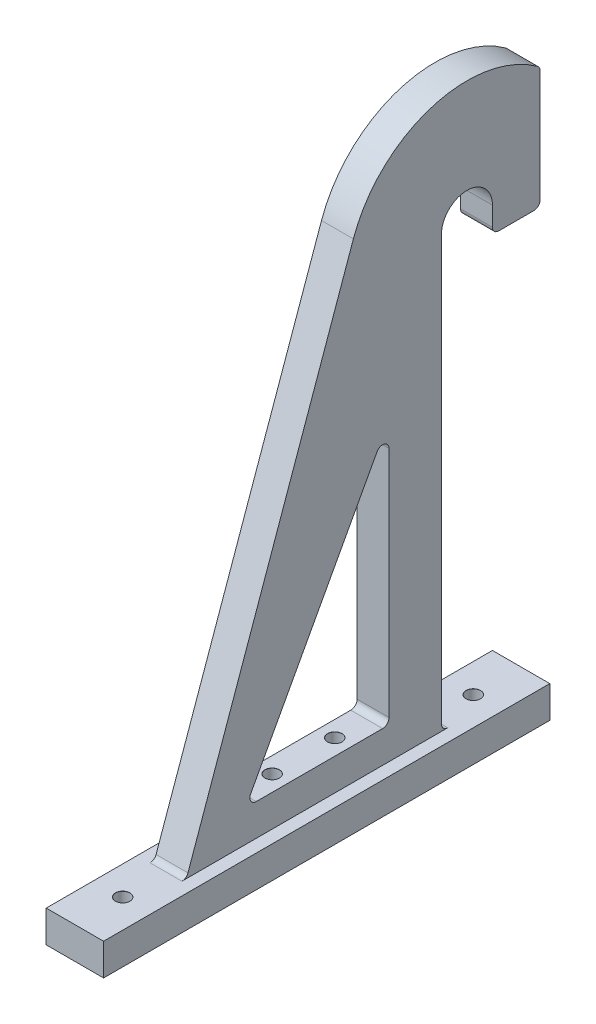
ISO-10303-21;
HEADER;
FILE_DESCRIPTION(('STEP AP214'),'2;1');
FILE_NAME('part.step','',(''),(''),'','','');
FILE_SCHEMA(('AUTOMOTIVE_DESIGN { 1 0 10303 214 1 1 1 1 }'));
ENDSEC;
DATA;
#1=APPLICATION_CONTEXT('core data for automotive mechanical design processes');
#2=APPLICATION_PROTOCOL_DEFINITION('international standard','automotive_design',2000,#1);
#3=PRODUCT_CONTEXT('',#1,'mechanical');
#4=PRODUCT('Part','Part','',(#3));
#5=PRODUCT_RELATED_PRODUCT_CATEGORY('part','',(#4));
#6=PRODUCT_DEFINITION_FORMATION('','',#4);
#7=PRODUCT_DEFINITION_CONTEXT('part definition',#1,'design');
#8=PRODUCT_DEFINITION('design','',#6,#7);
#9=PRODUCT_DEFINITION_SHAPE('','',#8);
#10=(LENGTH_UNIT() NAMED_UNIT(*) SI_UNIT(.MILLI.,.METRE.));
#11=(NAMED_UNIT(*) PLANE_ANGLE_UNIT() SI_UNIT($,.RADIAN.));
#12=(NAMED_UNIT(*) SI_UNIT($,.STERADIAN.) SOLID_ANGLE_UNIT());
#13=UNCERTAINTY_MEASURE_WITH_UNIT(LENGTH_MEASURE(1.E-05),#10,'distance_accuracy_value','');
#14=(GEOMETRIC_REPRESENTATION_CONTEXT(3) GLOBAL_UNCERTAINTY_ASSIGNED_CONTEXT((#13)) GLOBAL_UNIT_ASSIGNED_CONTEXT((#10,
#11,#12)) REPRESENTATION_CONTEXT('',''));
#15=CARTESIAN_POINT('',(0.,0.,0.));
#16=DIRECTION('',(0.,0.,1.));
#17=DIRECTION('',(1.,0.,0.));
#18=AXIS2_PLACEMENT_3D('',#15,#16,#17);
#19=CARTESIAN_POINT('',(-9.01,0.,-107.32073380901));
#20=DIRECTION('',(0.,1.,0.));
#21=DIRECTION('',(0.,0.,1.));
#22=AXIS2_PLACEMENT_3D('',#19,#20,#21);
#23=PLANE('',#22);
#24=CARTESIAN_POINT('',(0.,0.,8.0932319262162));
#25=DIRECTION('',(0.,1.,0.));
#26=DIRECTION('',(0.,0.,1.));
#27=AXIS2_PLACEMENT_3D('',#24,#25,#26);
#28=CIRCLE('',#27,2.25);
#29=CARTESIAN_POINT('',(0.,0.,10.3432319262162));
#30=VERTEX_POINT('',#29);
#31=EDGE_CURVE('E142',#30,#30,#28,.T.);
#32=ORIENTED_EDGE('',*,*,#31,.F.);
#33=EDGE_LOOP('',(#32));
#34=FACE_BOUND('',#33,.T.);
#35=CARTESIAN_POINT('',(0.,0.,-11.5473950131723));
#36=DIRECTION('',(0.,1.,0.));
#37=DIRECTION('',(0.,0.,1.));
#38=AXIS2_PLACEMENT_3D('',#35,#36,#37);
#39=CIRCLE('',#38,2.25);
#40=CARTESIAN_POINT('',(0.,0.,-9.2973950131723));
#41=VERTEX_POINT('',#40);
#42=EDGE_CURVE('E145',#41,#41,#39,.T.);
#43=ORIENTED_EDGE('',*,*,#42,.F.);
#44=EDGE_LOOP('',(#43));
#45=FACE_BOUND('',#44,.T.);
#46=CARTESIAN_POINT('',(0.,0.,55.));
#47=DIRECTION('',(0.,1.,0.));
#48=DIRECTION('',(0.,0.,1.));
#49=AXIS2_PLACEMENT_3D('',#46,#47,#48);
#50=CIRCLE('',#49,2.275);
#51=CARTESIAN_POINT('',(0.,0.,57.275));
#52=VERTEX_POINT('',#51);
#53=EDGE_CURVE('E148',#52,#52,#50,.T.);
#54=ORIENTED_EDGE('',*,*,#53,.F.);
#55=EDGE_LOOP('',(#54));
#56=FACE_BOUND('',#55,.T.);
#57=CARTESIAN_POINT('',(0.,0.,-55.));
#58=DIRECTION('',(0.,1.,0.));
#59=DIRECTION('',(0.,0.,1.));
#60=AXIS2_PLACEMENT_3D('',#57,#58,#59);
#61=CIRCLE('',#60,2.275);
#62=CARTESIAN_POINT('',(0.,0.,-52.725));
#63=VERTEX_POINT('',#62);
#64=EDGE_CURVE('E157',#63,#63,#61,.T.);
#65=ORIENTED_EDGE('',*,*,#64,.F.);
#66=EDGE_LOOP('',(#65));
#67=FACE_BOUND('',#66,.T.);
#68=DIRECTION('',(1.,0.,0.));
#69=VECTOR('',#68,1.);
#70=CARTESIAN_POINT('',(0.,0.,70.));
#71=LINE('',#70,#69);
#72=CARTESIAN_POINT('',(-9.,0.,70.));
#73=VERTEX_POINT('',#72);
#74=CARTESIAN_POINT('',(9.,0.,70.));
#75=VERTEX_POINT('',#74);
#76=EDGE_CURVE('E176',#73,#75,#71,.T.);
#77=ORIENTED_EDGE('',*,*,#76,.T.);
#78=DIRECTION('',(0.,0.,1.));
#79=VECTOR('',#78,1.);
#80=CARTESIAN_POINT('',(9.,0.,-70.));
#81=LINE('',#80,#79);
#82=CARTESIAN_POINT('',(9.,0.,-70.));
#83=VERTEX_POINT('',#82);
#84=EDGE_CURVE('E173',#83,#75,#81,.T.);
#85=ORIENTED_EDGE('',*,*,#84,.F.);
#86=DIRECTION('',(1.,0.,0.));
#87=VECTOR('',#86,1.);
#88=CARTESIAN_POINT('',(0.,0.,-70.));
#89=LINE('',#88,#87);
#90=CARTESIAN_POINT('',(-9.,0.,-70.));
#91=VERTEX_POINT('',#90);
#92=EDGE_CURVE('E172',#91,#83,#89,.T.);
#93=ORIENTED_EDGE('',*,*,#92,.F.);
#94=DIRECTION('',(0.,0.,-1.));
#95=VECTOR('',#94,1.);
#96=CARTESIAN_POINT('',(-9.,0.,-70.));
#97=LINE('',#96,#95);
#98=EDGE_CURVE('E187',#73,#91,#97,.T.);
#99=ORIENTED_EDGE('',*,*,#98,.F.);
#100=EDGE_LOOP('',(#77,#85,#93,#99));
#101=FACE_BOUND('',#100,.T.);
#102=ADVANCED_FACE('F65',(#34,#45,#56,#67,#101),#23,.T.);
#103=CARTESIAN_POINT('',(9.,-5.,0.));
#104=DIRECTION('',(1.,0.,0.));
#105=DIRECTION('',(0.,1.,0.));
#106=AXIS2_PLACEMENT_3D('',#103,#104,#105);
#107=PLANE('',#106);
#108=DIRECTION('',(0.,0.,-1.));
#109=VECTOR('',#108,1.);
#110=CARTESIAN_POINT('',(9.,-10.,70.));
#111=LINE('',#110,#109);
#112=CARTESIAN_POINT('',(9.,-10.,70.));
#113=VERTEX_POINT('',#112);
#114=CARTESIAN_POINT('',(9.,-10.,-70.));
#115=VERTEX_POINT('',#114);
#116=EDGE_CURVE('E166',#113,#115,#111,.T.);
#117=ORIENTED_EDGE('',*,*,#116,.T.);
#118=DIRECTION('',(0.,1.,0.));
#119=VECTOR('',#118,1.);
#120=CARTESIAN_POINT('',(9.,-10.,-70.));
#121=LINE('',#120,#119);
#122=EDGE_CURVE('E169',#115,#83,#121,.T.);
#123=ORIENTED_EDGE('',*,*,#122,.T.);
#124=ORIENTED_EDGE('',*,*,#84,.T.);
#125=DIRECTION('',(0.,-1.,0.));
#126=VECTOR('',#125,1.);
#127=CARTESIAN_POINT('',(9.,0.,70.));
#128=LINE('',#127,#126);
#129=EDGE_CURVE('E180',#75,#113,#128,.T.);
#130=ORIENTED_EDGE('',*,*,#129,.T.);
#131=EDGE_LOOP('',(#117,#123,#124,#130));
#132=FACE_BOUND('',#131,.T.);
#133=ADVANCED_FACE('F219',(#132),#107,.T.);
#134=CARTESIAN_POINT('',(0.,-10.,70.));
#135=DIRECTION('',(0.,-1.,0.));
#136=DIRECTION('',(0.,0.,-1.));
#137=AXIS2_PLACEMENT_3D('',#134,#135,#136);
#138=PLANE('',#137);
#139=CARTESIAN_POINT('',(0.,-10.,55.));
#140=DIRECTION('',(0.,1.,0.));
#141=DIRECTION('',(0.,0.,1.));
#142=AXIS2_PLACEMENT_3D('',#139,#140,#141);
#143=CIRCLE('',#142,2.25);
#144=CARTESIAN_POINT('',(0.,-10.,57.25));
#145=VERTEX_POINT('',#144);
#146=EDGE_CURVE('E154',#145,#145,#143,.T.);
#147=ORIENTED_EDGE('',*,*,#146,.T.);
#148=EDGE_LOOP('',(#147));
#149=FACE_BOUND('',#148,.T.);
#150=CARTESIAN_POINT('',(0.,-10.,-55.));
#151=DIRECTION('',(0.,1.,0.));
#152=DIRECTION('',(0.,0.,1.));
#153=AXIS2_PLACEMENT_3D('',#150,#151,#152);
#154=CIRCLE('',#153,2.25);
#155=CARTESIAN_POINT('',(0.,-10.,-52.75));
#156=VERTEX_POINT('',#155);
#157=EDGE_CURVE('E163',#156,#156,#154,.T.);
#158=ORIENTED_EDGE('',*,*,#157,.T.);
#159=EDGE_LOOP('',(#158));
#160=FACE_BOUND('',#159,.T.);
#161=DIRECTION('',(1.,0.,0.));
#162=VECTOR('',#161,1.);
#163=CARTESIAN_POINT('',(0.,-10.,-70.));
#164=LINE('',#163,#162);
#165=CARTESIAN_POINT('',(-9.,-10.,-70.));
#166=VERTEX_POINT('',#165);
#167=EDGE_CURVE('E86',#166,#115,#164,.T.);
#168=ORIENTED_EDGE('',*,*,#167,.T.);
#169=ORIENTED_EDGE('',*,*,#116,.F.);
#170=DIRECTION('',(-1.,0.,0.));
#171=VECTOR('',#170,1.);
#172=CARTESIAN_POINT('',(0.,-10.,70.));
#173=LINE('',#172,#171);
#174=CARTESIAN_POINT('',(-9.,-10.,70.));
#175=VERTEX_POINT('',#174);
#176=EDGE_CURVE('E96',#113,#175,#173,.T.);
#177=ORIENTED_EDGE('',*,*,#176,.T.);
#178=DIRECTION('',(0.,0.,1.));
#179=VECTOR('',#178,1.);
#180=CARTESIAN_POINT('',(-9.,-10.,70.));
#181=LINE('',#180,#179);
#182=EDGE_CURVE('E12',#166,#175,#181,.T.);
#183=ORIENTED_EDGE('',*,*,#182,.F.);
#184=EDGE_LOOP('',(#168,#169,#177,#183));
#185=FACE_BOUND('',#184,.T.);
#186=ADVANCED_FACE('F221',(#149,#160,#185),#138,.T.);
#187=CARTESIAN_POINT('',(0.,-10.,-70.));
#188=DIRECTION('',(0.,0.,-1.));
#189=DIRECTION('',(0.,-1.,0.));
#190=AXIS2_PLACEMENT_3D('',#187,#188,#189);
#191=PLANE('',#190);
#192=ORIENTED_EDGE('',*,*,#92,.T.);
#193=ORIENTED_EDGE('',*,*,#122,.F.);
#194=ORIENTED_EDGE('',*,*,#167,.F.);
#195=DIRECTION('',(0.,-1.,0.));
#196=VECTOR('',#195,1.);
#197=CARTESIAN_POINT('',(-9.,-10.,-70.));
#198=LINE('',#197,#196);
#199=EDGE_CURVE('E186',#91,#166,#198,.T.);
#200=ORIENTED_EDGE('',*,*,#199,.F.);
#201=EDGE_LOOP('',(#192,#193,#194,#200));
#202=FACE_BOUND('',#201,.T.);
#203=ADVANCED_FACE('F227',(#202),#191,.T.);
#204=CARTESIAN_POINT('',(0.,0.,70.));
#205=DIRECTION('',(0.,0.,1.));
#206=DIRECTION('',(1.,0.,0.));
#207=AXIS2_PLACEMENT_3D('',#204,#205,#206);
#208=PLANE('',#207);
#209=ORIENTED_EDGE('',*,*,#176,.F.);
#210=ORIENTED_EDGE('',*,*,#129,.F.);
#211=ORIENTED_EDGE('',*,*,#76,.F.);
#212=DIRECTION('',(0.,1.,0.));
#213=VECTOR('',#212,1.);
#214=CARTESIAN_POINT('',(-9.,0.,70.));
#215=LINE('',#214,#213);
#216=EDGE_CURVE('E74',#175,#73,#215,.T.);
#217=ORIENTED_EDGE('',*,*,#216,.F.);
#218=EDGE_LOOP('',(#209,#210,#211,#217));
#219=FACE_BOUND('',#218,.T.);
#220=ADVANCED_FACE('F237',(#219),#208,.T.);
#221=CARTESIAN_POINT('',(-9.,-5.,0.));
#222=DIRECTION('',(-1.,0.,0.));
#223=DIRECTION('',(0.,0.,1.));
#224=AXIS2_PLACEMENT_3D('',#221,#222,#223);
#225=PLANE('',#224);
#226=ORIENTED_EDGE('',*,*,#182,.T.);
#227=ORIENTED_EDGE('',*,*,#216,.T.);
#228=ORIENTED_EDGE('',*,*,#98,.T.);
#229=ORIENTED_EDGE('',*,*,#199,.T.);
#230=EDGE_LOOP('',(#226,#227,#228,#229));
#231=FACE_BOUND('',#230,.T.);
#232=ADVANCED_FACE('F233',(#231),#225,.T.);
#233=CARTESIAN_POINT('',(0.,0.,-55.));
#234=DIRECTION('',(0.,1.,0.));
#235=DIRECTION('',(0.,0.,1.));
#236=AXIS2_PLACEMENT_3D('',#233,#234,#235);
#237=CYLINDRICAL_SURFACE('',#236,2.25);
#238=ORIENTED_EDGE('',*,*,#157,.F.);
#239=EDGE_LOOP('',(#238));
#240=FACE_BOUND('',#239,.T.);
#241=CARTESIAN_POINT('',(0.,-0.0250000000000025,-55.));
#242=DIRECTION('',(0.,1.,0.));
#243=DIRECTION('',(0.,0.,1.));
#244=AXIS2_PLACEMENT_3D('',#241,#242,#243);
#245=CIRCLE('',#244,2.25);
#246=CARTESIAN_POINT('',(0.,-0.0250000000000025,-52.75));
#247=VERTEX_POINT('',#246);
#248=EDGE_CURVE('E160',#247,#247,#245,.T.);
#249=ORIENTED_EDGE('',*,*,#248,.T.);
#250=EDGE_LOOP('',(#249));
#251=FACE_BOUND('',#250,.T.);
#252=ADVANCED_FACE('F232',(#240,#251),#237,.F.);
#253=CARTESIAN_POINT('',(0.,0.,-55.));
#254=DIRECTION('',(0.,1.,0.));
#255=DIRECTION('',(0.,0.,1.));
#256=AXIS2_PLACEMENT_3D('',#253,#254,#255);
#257=CONICAL_SURFACE('',#256,2.275,0.785398163397414);
#258=ORIENTED_EDGE('',*,*,#248,.F.);
#259=EDGE_LOOP('',(#258));
#260=FACE_BOUND('',#259,.T.);
#261=ORIENTED_EDGE('',*,*,#64,.T.);
#262=EDGE_LOOP('',(#261));
#263=FACE_BOUND('',#262,.T.);
#264=ADVANCED_FACE('F245',(#260,#263),#257,.F.);
#265=CARTESIAN_POINT('',(0.,0.,55.));
#266=DIRECTION('',(0.,1.,0.));
#267=DIRECTION('',(0.,0.,1.));
#268=AXIS2_PLACEMENT_3D('',#265,#266,#267);
#269=CYLINDRICAL_SURFACE('',#268,2.25);
#270=ORIENTED_EDGE('',*,*,#146,.F.);
#271=EDGE_LOOP('',(#270));
#272=FACE_BOUND('',#271,.T.);
#273=CARTESIAN_POINT('',(0.,-0.0250000000000025,55.));
#274=DIRECTION('',(0.,1.,0.));
#275=DIRECTION('',(0.,0.,1.));
#276=AXIS2_PLACEMENT_3D('',#273,#274,#275);
#277=CIRCLE('',#276,2.25);
#278=CARTESIAN_POINT('',(0.,-0.0250000000000025,57.25));
#279=VERTEX_POINT('',#278);
#280=EDGE_CURVE('E151',#279,#279,#277,.T.);
#281=ORIENTED_EDGE('',*,*,#280,.T.);
#282=EDGE_LOOP('',(#281));
#283=FACE_BOUND('',#282,.T.);
#284=ADVANCED_FACE('F249',(#272,#283),#269,.F.);
#285=CARTESIAN_POINT('',(0.,0.,55.));
#286=DIRECTION('',(0.,1.,0.));
#287=DIRECTION('',(0.,0.,1.));
#288=AXIS2_PLACEMENT_3D('',#285,#286,#287);
#289=CONICAL_SURFACE('',#288,2.275,0.785398163397414);
#290=ORIENTED_EDGE('',*,*,#280,.F.);
#291=EDGE_LOOP('',(#290));
#292=FACE_BOUND('',#291,.T.);
#293=ORIENTED_EDGE('',*,*,#53,.T.);
#294=EDGE_LOOP('',(#293));
#295=FACE_BOUND('',#294,.T.);
#296=ADVANCED_FACE('F253',(#292,#295),#289,.F.);
#297=CARTESIAN_POINT('',(0.,0.,-11.5473950131723));
#298=DIRECTION('',(0.,1.,0.));
#299=DIRECTION('',(0.,0.,1.));
#300=AXIS2_PLACEMENT_3D('',#297,#298,#299);
#301=CONICAL_SURFACE('',#300,2.25,1.02974425867665);
#302=CARTESIAN_POINT('',(0.,-0.330473340465158,-11.5473950131723));
#303=DIRECTION('',(0.,1.,0.));
#304=DIRECTION('',(0.,0.,1.));
#305=AXIS2_PLACEMENT_3D('',#302,#303,#304);
#306=CIRCLE('',#305,1.7);
#307=CARTESIAN_POINT('',(0.,-0.330473340465159,-9.8473950131723));
#308=VERTEX_POINT('',#307);
#309=EDGE_CURVE('E68',#308,#308,#306,.F.);
#310=ORIENTED_EDGE('',*,*,#309,.T.);
#311=EDGE_LOOP('',(#310));
#312=FACE_BOUND('',#311,.T.);
#313=ORIENTED_EDGE('',*,*,#42,.T.);
#314=EDGE_LOOP('',(#313));
#315=FACE_BOUND('',#314,.T.);
#316=ADVANCED_FACE('F216',(#312,#315),#301,.F.);
#317=CARTESIAN_POINT('',(0.,0.,8.0932319262162));
#318=DIRECTION('',(0.,1.,0.));
#319=DIRECTION('',(0.,0.,1.));
#320=AXIS2_PLACEMENT_3D('',#317,#318,#319);
#321=CONICAL_SURFACE('',#320,2.25,1.02974425867665);
#322=CARTESIAN_POINT('',(0.,-0.33047334046516,8.0932319262162));
#323=DIRECTION('',(0.,1.,0.));
#324=DIRECTION('',(0.,0.,1.));
#325=AXIS2_PLACEMENT_3D('',#322,#323,#324);
#326=CIRCLE('',#325,1.7);
#327=CARTESIAN_POINT('',(0.,-0.33047334046516,9.7932319262162));
#328=VERTEX_POINT('',#327);
#329=EDGE_CURVE('E141',#328,#328,#326,.F.);
#330=ORIENTED_EDGE('',*,*,#329,.T.);
#331=EDGE_LOOP('',(#330));
#332=FACE_BOUND('',#331,.T.);
#333=ORIENTED_EDGE('',*,*,#31,.T.);
#334=EDGE_LOOP('',(#333));
#335=FACE_BOUND('',#334,.T.);
#336=ADVANCED_FACE('F202',(#332,#335),#321,.F.);
#337=CARTESIAN_POINT('',(0.,0.,8.0932319262162));
#338=DIRECTION('',(0.,1.,0.));
#339=DIRECTION('',(0.,0.,1.));
#340=AXIS2_PLACEMENT_3D('',#337,#338,#339);
#341=CYLINDRICAL_SURFACE('',#340,1.7);
#342=CARTESIAN_POINT('',(0.,-5.,8.0932319262162));
#343=DIRECTION('',(0.,1.,0.));
#344=DIRECTION('',(0.,0.,1.));
#345=AXIS2_PLACEMENT_3D('',#342,#343,#344);
#346=CIRCLE('',#345,1.7);
#347=CARTESIAN_POINT('',(0.,-5.,9.7932319262162));
#348=VERTEX_POINT('',#347);
#349=EDGE_CURVE('E137',#348,#348,#346,.T.);
#350=ORIENTED_EDGE('',*,*,#349,.F.);
#351=EDGE_LOOP('',(#350));
#352=FACE_BOUND('',#351,.T.);
#353=ORIENTED_EDGE('',*,*,#329,.F.);
#354=EDGE_LOOP('',(#353));
#355=FACE_BOUND('',#354,.T.);
#356=ADVANCED_FACE('F205',(#352,#355),#341,.F.);
#357=CARTESIAN_POINT('',(0.,-5.,8.0932319262162));
#358=DIRECTION('',(0.,1.,0.));
#359=DIRECTION('',(0.,0.,1.));
#360=AXIS2_PLACEMENT_3D('',#357,#358,#359);
#361=CONICAL_SURFACE('',#360,1.7,1.02974425867665);
#362=CARTESIAN_POINT('',(0.,-6.02146305234685,8.0932319262162));
#363=VERTEX_POINT('',#362);
#364=VERTEX_LOOP('',#363);
#365=FACE_BOUND('',#364,.T.);
#366=ORIENTED_EDGE('',*,*,#349,.T.);
#367=EDGE_LOOP('',(#366));
#368=FACE_BOUND('',#367,.T.);
#369=ADVANCED_FACE('F207',(#365,#368),#361,.F.);
#370=CARTESIAN_POINT('',(0.,0.,-11.5473950131723));
#371=DIRECTION('',(0.,1.,0.));
#372=DIRECTION('',(0.,0.,1.));
#373=AXIS2_PLACEMENT_3D('',#370,#371,#372);
#374=CYLINDRICAL_SURFACE('',#373,1.7);
#375=CARTESIAN_POINT('',(0.,-5.,-11.5473950131723));
#376=DIRECTION('',(0.,1.,0.));
#377=DIRECTION('',(0.,0.,1.));
#378=AXIS2_PLACEMENT_3D('',#375,#376,#377);
#379=CIRCLE('',#378,1.7);
#380=CARTESIAN_POINT('',(0.,-5.,-9.8473950131723));
#381=VERTEX_POINT('',#380);
#382=EDGE_CURVE('E133',#381,#381,#379,.T.);
#383=ORIENTED_EDGE('',*,*,#382,.F.);
#384=EDGE_LOOP('',(#383));
#385=FACE_BOUND('',#384,.T.);
#386=ORIENTED_EDGE('',*,*,#309,.F.);
#387=EDGE_LOOP('',(#386));
#388=FACE_BOUND('',#387,.T.);
#389=ADVANCED_FACE('F129',(#385,#388),#374,.F.);
#390=CARTESIAN_POINT('',(0.,-5.,-11.5473950131723));
#391=DIRECTION('',(0.,1.,0.));
#392=DIRECTION('',(0.,0.,1.));
#393=AXIS2_PLACEMENT_3D('',#390,#391,#392);
#394=CONICAL_SURFACE('',#393,1.7,1.02974425867665);
#395=CARTESIAN_POINT('',(0.,-6.02146305234685,-11.5473950131723));
#396=VERTEX_POINT('',#395);
#397=VERTEX_LOOP('',#396);
#398=FACE_BOUND('',#397,.T.);
#399=ORIENTED_EDGE('',*,*,#382,.T.);
#400=EDGE_LOOP('',(#399));
#401=FACE_BOUND('',#400,.T.);
#402=ADVANCED_FACE('F126',(#398,#401),#394,.F.);
#403=CLOSED_SHELL('',(#102,#133,#186,#203,#220,#232,#252,#264,#284,#296,#316,#336,#356,#369,
#389,#402));
#404=MANIFOLD_SOLID_BREP('B2',#403);
#405=CARTESIAN_POINT('',(-9.01,0.,-107.32073380901));
#406=DIRECTION('',(0.,1.,0.));
#407=DIRECTION('',(0.,0.,1.));
#408=AXIS2_PLACEMENT_3D('',#405,#406,#407);
#409=PLANE('',#408);
#410=CARTESIAN_POINT('',(0.,0.,8.0932319262162));
#411=DIRECTION('',(0.,1.,0.));
#412=DIRECTION('',(0.,0.,1.));
#413=AXIS2_PLACEMENT_3D('',#410,#411,#412);
#414=CIRCLE('',#413,2.25);
#415=CARTESIAN_POINT('',(0.,0.,10.3432319262162));
#416=VERTEX_POINT('',#415);
#417=EDGE_CURVE('E1074',#416,#416,#414,.T.);
#418=ORIENTED_EDGE('',*,*,#417,.T.);
#419=EDGE_LOOP('',(#418));
#420=FACE_BOUND('',#419,.T.);
#421=CARTESIAN_POINT('',(0.,0.,-11.5473950131723));
#422=DIRECTION('',(0.,1.,0.));
#423=DIRECTION('',(0.,0.,1.));
#424=AXIS2_PLACEMENT_3D('',#421,#422,#423);
#425=CIRCLE('',#424,2.25);
#426=CARTESIAN_POINT('',(0.,0.,-9.2973950131723));
#427=VERTEX_POINT('',#426);
#428=EDGE_CURVE('E821',#427,#427,#425,.T.);
#429=ORIENTED_EDGE('',*,*,#428,.T.);
#430=EDGE_LOOP('',(#429));
#431=FACE_BOUND('',#430,.T.);
#432=DIRECTION('',(0.,0.,1.));
#433=VECTOR('',#432,1.);
#434=CARTESIAN_POINT('',(5.,0.,-42.75));
#435=LINE('',#434,#433);
#436=CARTESIAN_POINT('',(5.,0.,-42.));
#437=VERTEX_POINT('',#436);
#438=CARTESIAN_POINT('',(5.,0.,41.4126332599896));
#439=VERTEX_POINT('',#438);
#440=EDGE_CURVE('E428',#437,#439,#435,.T.);
#441=ORIENTED_EDGE('',*,*,#440,.T.);
#442=DIRECTION('',(1.,0.,0.));
#443=VECTOR('',#442,1.);
#444=CARTESIAN_POINT('',(0.,0.,41.4126332599896));
#445=LINE('',#444,#443);
#446=CARTESIAN_POINT('',(-5.,0.,41.4126332599896));
#447=VERTEX_POINT('',#446);
#448=EDGE_CURVE('E613',#447,#439,#445,.T.);
#449=ORIENTED_EDGE('',*,*,#448,.F.);
#450=DIRECTION('',(0.,0.,-1.));
#451=VECTOR('',#450,1.);
#452=CARTESIAN_POINT('',(-5.,0.,-42.75));
#453=LINE('',#452,#451);
#454=CARTESIAN_POINT('',(-5.,0.,-42.));
#455=VERTEX_POINT('',#454);
#456=EDGE_CURVE('E63',#447,#455,#453,.T.);
#457=ORIENTED_EDGE('',*,*,#456,.T.);
#458=DIRECTION('',(-1.,0.,0.));
#459=VECTOR('',#458,1.);
#460=CARTESIAN_POINT('',(0.,0.,-42.));
#461=LINE('',#460,#459);
#462=EDGE_CURVE('E444',#437,#455,#461,.T.);
#463=ORIENTED_EDGE('',*,*,#462,.F.);
#464=EDGE_LOOP('',(#441,#449,#457,#463));
#465=FACE_BOUND('',#464,.T.);
#466=ADVANCED_FACE('F425',(#420,#431,#465),#409,.F.);
#467=CARTESIAN_POINT('',(5.,86.4010581714358,-15.5));
#468=DIRECTION('',(1.,0.,0.));
#469=DIRECTION('',(0.,1.,0.));
#470=AXIS2_PLACEMENT_3D('',#467,#468,#469);
#471=PLANE('',#470);
#472=DIRECTION('',(0.,0.879107079568804,-0.476624320248147));
#473=VECTOR('',#472,1.);
#474=CARTESIAN_POINT('',(5.,47.2641277411276,1.24916223561393));
#475=LINE('',#474,#473);
#476=CARTESIAN_POINT('',(5.,12.9532486404963,19.8514460853538));
#477=VERTEX_POINT('',#476);
#478=CARTESIAN_POINT('',(5.,86.0681827731462,-19.7891808540347));
#479=VERTEX_POINT('',#478);
#480=EDGE_CURVE('E675',#477,#479,#475,.T.);
#481=ORIENTED_EDGE('',*,*,#480,.T.);
#482=CARTESIAN_POINT('',(5.,85.1149341326499,-21.5473950131723));
#483=DIRECTION('',(1.,0.,0.));
#484=DIRECTION('',(0.,0.969305699861712,-0.245858618347205));
#485=AXIS2_PLACEMENT_3D('',#482,#483,#484);
#486=CIRCLE('',#485,2.);
#487=CARTESIAN_POINT('',(5.,85.1149341326499,-23.5473950131723));
#488=VERTEX_POINT('',#487);
#489=EDGE_CURVE('E744',#488,#479,#486,.T.);
#490=ORIENTED_EDGE('',*,*,#489,.F.);
#491=DIRECTION('',(0.,-1.,0.));
#492=VECTOR('',#491,1.);
#493=CARTESIAN_POINT('',(5.,89.7005290857179,-23.5473950131723));
#494=LINE('',#493,#492);
#495=CARTESIAN_POINT('',(5.,12.,-23.5473950131723));
#496=VERTEX_POINT('',#495);
#497=EDGE_CURVE('E701',#488,#496,#494,.T.);
#498=ORIENTED_EDGE('',*,*,#497,.T.);
#499=CARTESIAN_POINT('',(5.,12.,-21.5473950131723));
#500=DIRECTION('',(1.,0.,0.));
#501=DIRECTION('',(0.,-0.707106781186548,-0.707106781186548));
#502=AXIS2_PLACEMENT_3D('',#499,#500,#501);
#503=CIRCLE('',#502,2.);
#504=CARTESIAN_POINT('',(5.,10.,-21.5473950131723));
#505=VERTEX_POINT('',#504);
#506=EDGE_CURVE('E612',#505,#496,#503,.T.);
#507=ORIENTED_EDGE('',*,*,#506,.F.);
#508=DIRECTION('',(0.,0.,1.));
#509=VECTOR('',#508,1.);
#510=CARTESIAN_POINT('',(5.,10.,-19.5236975065862));
#511=LINE('',#510,#509);
#512=CARTESIAN_POINT('',(5.,10.,18.0932319262162));
#513=VERTEX_POINT('',#512);
#514=EDGE_CURVE('E741',#505,#513,#511,.T.);
#515=ORIENTED_EDGE('',*,*,#514,.T.);
#516=CARTESIAN_POINT('',(5.,12.,18.0932319262162));
#517=DIRECTION('',(1.,0.,0.));
#518=DIRECTION('',(0.,-0.511554337168524,0.859250929661454));
#519=AXIS2_PLACEMENT_3D('',#516,#517,#518);
#520=CIRCLE('',#519,2.);
#521=EDGE_CURVE('E773',#477,#513,#520,.T.);
#522=ORIENTED_EDGE('',*,*,#521,.F.);
#523=EDGE_LOOP('',(#481,#490,#498,#507,#515,#522));
#524=FACE_BOUND('',#523,.T.);
#525=CARTESIAN_POINT('',(5.,163.996405546697,-69.));
#526=DIRECTION('',(-1.,0.,0.));
#527=DIRECTION('',(0.,0.454666084065982,-0.890661974039593));
#528=AXIS2_PLACEMENT_3D('',#525,#526,#527);
#529=CIRCLE('',#528,2.);
#530=CARTESIAN_POINT('',(5.,165.616220714549,-70.1731150080004));
#531=VERTEX_POINT('',#530);
#532=CARTESIAN_POINT('',(5.,163.996405546697,-71.));
#533=VERTEX_POINT('',#532);
#534=EDGE_CURVE('E619',#531,#533,#529,.T.);
#535=ORIENTED_EDGE('',*,*,#534,.F.);
#536=CARTESIAN_POINT('',(5.,135.,-48.));
#537=DIRECTION('',(1.,0.,0.));
#538=DIRECTION('',(0.,0.793606361291916,-0.608431543657135));
#539=AXIS2_PLACEMENT_3D('',#536,#537,#538);
#540=CIRCLE('',#539,37.8021163428716);
#541=CARTESIAN_POINT('',(5.,147.638260601373,-12.3731229410748));
#542=VERTEX_POINT('',#541);
#543=EDGE_CURVE('E616',#531,#542,#540,.T.);
#544=ORIENTED_EDGE('',*,*,#543,.T.);
#545=DIRECTION('',(0.,-0.942457208897602,0.334326800297166));
#546=VECTOR('',#545,1.);
#547=CARTESIAN_POINT('',(5.,147.638260601373,-12.3731229410748));
#548=LINE('',#547,#546);
#549=CARTESIAN_POINT('',(5.,1.33134639940566,39.5277188421943));
#550=VERTEX_POINT('',#549);
#551=EDGE_CURVE('E600',#542,#550,#548,.T.);
#552=ORIENTED_EDGE('',*,*,#551,.T.);
#553=CARTESIAN_POINT('',(5.,2.,41.4126332599896));
#554=DIRECTION('',(1.,0.,0.));
#555=DIRECTION('',(0.,-0.816800710178795,-0.576919924990822));
#556=AXIS2_PLACEMENT_3D('',#553,#554,#555);
#557=CIRCLE('',#556,2.);
#558=EDGE_CURVE('E759',#439,#550,#557,.T.);
#559=ORIENTED_EDGE('',*,*,#558,.F.);
#560=ORIENTED_EDGE('',*,*,#440,.F.);
#561=CARTESIAN_POINT('',(5.,2.,-42.));
#562=DIRECTION('',(1.,0.,0.));
#563=DIRECTION('',(0.,-0.707106781186546,0.707106781186549));
#564=AXIS2_PLACEMENT_3D('',#561,#562,#563);
#565=CIRCLE('',#564,2.);
#566=CARTESIAN_POINT('',(5.,2.,-40.));
#567=VERTEX_POINT('',#566);
#568=EDGE_CURVE('E659',#567,#437,#565,.T.);
#569=ORIENTED_EDGE('',*,*,#568,.F.);
#570=DIRECTION('',(0.,1.,0.));
#571=VECTOR('',#570,1.);
#572=CARTESIAN_POINT('',(5.,0.,-40.));
#573=LINE('',#572,#571);
#574=CARTESIAN_POINT('',(5.,135.,-40.));
#575=VERTEX_POINT('',#574);
#576=EDGE_CURVE('E755',#567,#575,#573,.T.);
#577=ORIENTED_EDGE('',*,*,#576,.T.);
#578=CARTESIAN_POINT('',(5.,135.,-48.));
#579=DIRECTION('',(-1.,0.,0.));
#580=DIRECTION('',(0.,0.,1.));
#581=AXIS2_PLACEMENT_3D('',#578,#579,#580);
#582=CIRCLE('',#581,8.);
#583=CARTESIAN_POINT('',(5.,135.,-56.));
#584=VERTEX_POINT('',#583);
#585=EDGE_CURVE('E648',#575,#584,#582,.T.);
#586=ORIENTED_EDGE('',*,*,#585,.T.);
#587=DIRECTION('',(0.,-1.,0.));
#588=VECTOR('',#587,1.);
#589=CARTESIAN_POINT('',(5.,135.,-56.));
#590=LINE('',#589,#588);
#591=CARTESIAN_POINT('',(5.,129.,-56.));
#592=VERTEX_POINT('',#591);
#593=EDGE_CURVE('E649',#584,#592,#590,.T.);
#594=ORIENTED_EDGE('',*,*,#593,.T.);
#595=CARTESIAN_POINT('',(5.,129.,-58.));
#596=DIRECTION('',(-1.,0.,0.));
#597=DIRECTION('',(0.,-0.707106781186548,0.707106781186548));
#598=AXIS2_PLACEMENT_3D('',#595,#596,#597);
#599=CIRCLE('',#598,2.);
#600=CARTESIAN_POINT('',(5.,127.,-58.));
#601=VERTEX_POINT('',#600);
#602=EDGE_CURVE('E724',#601,#592,#599,.T.);
#603=ORIENTED_EDGE('',*,*,#602,.F.);
#604=DIRECTION('',(0.,0.,-1.));
#605=VECTOR('',#604,1.);
#606=CARTESIAN_POINT('',(5.,127.,-56.));
#607=LINE('',#606,#605);
#608=CARTESIAN_POINT('',(5.,127.,-69.));
#609=VERTEX_POINT('',#608);
#610=EDGE_CURVE('E731',#601,#609,#607,.T.);
#611=ORIENTED_EDGE('',*,*,#610,.T.);
#612=CARTESIAN_POINT('',(5.,129.,-69.));
#613=DIRECTION('',(-1.,0.,0.));
#614=DIRECTION('',(0.,-0.707106781186544,-0.707106781186551));
#615=AXIS2_PLACEMENT_3D('',#612,#613,#614);
#616=CIRCLE('',#615,2.);
#617=CARTESIAN_POINT('',(5.,129.,-71.));
#618=VERTEX_POINT('',#617);
#619=EDGE_CURVE('E717',#618,#609,#616,.T.);
#620=ORIENTED_EDGE('',*,*,#619,.F.);
#621=DIRECTION('',(0.,1.,0.));
#622=VECTOR('',#621,1.);
#623=CARTESIAN_POINT('',(5.,127.,-71.));
#624=LINE('',#623,#622);
#625=EDGE_CURVE('E678',#618,#533,#624,.T.);
#626=ORIENTED_EDGE('',*,*,#625,.T.);
#627=EDGE_LOOP('',(#535,#544,#552,#559,#560,#569,#577,#586,#594,#603,#611,#620,#626));
#628=FACE_BOUND('',#627,.T.);
#629=ADVANCED_FACE('F617',(#524,#628),#471,.T.);
#630=CARTESIAN_POINT('',(0.,135.,-48.));
#631=DIRECTION('',(1.,0.,0.));
#632=DIRECTION('',(0.,0.793606361291916,-0.608431543657135));
#633=AXIS2_PLACEMENT_3D('',#630,#631,#632);
#634=CYLINDRICAL_SURFACE('',#633,37.8021163428716);
#635=DIRECTION('',(1.,0.,0.));
#636=VECTOR('',#635,1.);
#637=CARTESIAN_POINT('',(0.,165.616220714549,-70.1731150080004));
#638=LINE('',#637,#636);
#639=CARTESIAN_POINT('',(-5.,165.616220714549,-70.1731150080004));
#640=VERTEX_POINT('',#639);
#641=EDGE_CURVE('E632',#640,#531,#638,.T.);
#642=ORIENTED_EDGE('',*,*,#641,.F.);
#643=CARTESIAN_POINT('',(-5.,135.,-48.));
#644=DIRECTION('',(-1.,0.,0.));
#645=DIRECTION('',(0.,0.793606361291916,-0.608431543657135));
#646=AXIS2_PLACEMENT_3D('',#643,#644,#645);
#647=CIRCLE('',#646,37.8021163428716);
#648=CARTESIAN_POINT('',(-5.,147.638260601373,-12.3731229410748));
#649=VERTEX_POINT('',#648);
#650=EDGE_CURVE('E627',#649,#640,#647,.T.);
#651=ORIENTED_EDGE('',*,*,#650,.F.);
#652=DIRECTION('',(-1.,0.,0.));
#653=VECTOR('',#652,1.);
#654=CARTESIAN_POINT('',(0.,147.638260601373,-12.3731229410748));
#655=LINE('',#654,#653);
#656=EDGE_CURVE('E605',#542,#649,#655,.T.);
#657=ORIENTED_EDGE('',*,*,#656,.F.);
#658=ORIENTED_EDGE('',*,*,#543,.F.);
#659=EDGE_LOOP('',(#642,#651,#657,#658));
#660=FACE_BOUND('',#659,.T.);
#661=ADVANCED_FACE('F626',(#660),#634,.T.);
#662=CARTESIAN_POINT('',(0.,147.638260601373,-12.3731229410748));
#663=DIRECTION('',(0.,0.334326800297166,0.942457208897602));
#664=DIRECTION('',(1.,0.,0.));
#665=AXIS2_PLACEMENT_3D('',#662,#663,#664);
#666=PLANE('',#665);
#667=DIRECTION('',(-1.,0.,0.));
#668=VECTOR('',#667,1.);
#669=CARTESIAN_POINT('',(0.,1.33134639940567,39.5277188421943));
#670=LINE('',#669,#668);
#671=CARTESIAN_POINT('',(-5.,1.33134639940566,39.5277188421943));
#672=VERTEX_POINT('',#671);
#673=EDGE_CURVE('E607',#550,#672,#670,.T.);
#674=ORIENTED_EDGE('',*,*,#673,.F.);
#675=ORIENTED_EDGE('',*,*,#551,.F.);
#676=ORIENTED_EDGE('',*,*,#656,.T.);
#677=DIRECTION('',(0.,0.942457208897602,-0.334326800297166));
#678=VECTOR('',#677,1.);
#679=CARTESIAN_POINT('',(-5.,147.638260601373,-12.3731229410748));
#680=LINE('',#679,#678);
#681=EDGE_CURVE('E690',#672,#649,#680,.T.);
#682=ORIENTED_EDGE('',*,*,#681,.F.);
#683=EDGE_LOOP('',(#674,#675,#676,#682));
#684=FACE_BOUND('',#683,.T.);
#685=ADVANCED_FACE('F602',(#684),#666,.T.);
#686=CARTESIAN_POINT('',(0.,2.,41.4126332599896));
#687=DIRECTION('',(-1.,0.,0.));
#688=DIRECTION('',(0.,-0.816800710178795,-0.576919924990822));
#689=AXIS2_PLACEMENT_3D('',#686,#687,#688);
#690=CYLINDRICAL_SURFACE('',#689,2.);
#691=ORIENTED_EDGE('',*,*,#558,.T.);
#692=ORIENTED_EDGE('',*,*,#673,.T.);
#693=CARTESIAN_POINT('',(-5.,2.,41.4126332599896));
#694=DIRECTION('',(-1.,0.,0.));
#695=DIRECTION('',(0.,-0.816800710178795,-0.576919924990822));
#696=AXIS2_PLACEMENT_3D('',#693,#694,#695);
#697=CIRCLE('',#696,2.);
#698=EDGE_CURVE('E686',#672,#447,#697,.T.);
#699=ORIENTED_EDGE('',*,*,#698,.T.);
#700=ORIENTED_EDGE('',*,*,#448,.T.);
#701=EDGE_LOOP('',(#691,#692,#699,#700));
#702=FACE_BOUND('',#701,.T.);
#703=ADVANCED_FACE('F841',(#702),#690,.F.);
#704=CARTESIAN_POINT('',(0.,2.,-42.));
#705=DIRECTION('',(1.,0.,0.));
#706=DIRECTION('',(0.,-0.707106781186546,0.707106781186549));
#707=AXIS2_PLACEMENT_3D('',#704,#705,#706);
#708=CYLINDRICAL_SURFACE('',#707,2.);
#709=CARTESIAN_POINT('',(-5.,2.,-42.));
#710=DIRECTION('',(-1.,0.,0.));
#711=DIRECTION('',(0.,-0.707106781186546,0.707106781186549));
#712=AXIS2_PLACEMENT_3D('',#709,#710,#711);
#713=CIRCLE('',#712,2.);
#714=CARTESIAN_POINT('',(-5.,2.,-40.));
#715=VERTEX_POINT('',#714);
#716=EDGE_CURVE('E683',#455,#715,#713,.T.);
#717=ORIENTED_EDGE('',*,*,#716,.T.);
#718=DIRECTION('',(1.,0.,0.));
#719=VECTOR('',#718,1.);
#720=CARTESIAN_POINT('',(0.,2.,-40.));
#721=LINE('',#720,#719);
#722=EDGE_CURVE('E662',#715,#567,#721,.T.);
#723=ORIENTED_EDGE('',*,*,#722,.T.);
#724=ORIENTED_EDGE('',*,*,#568,.T.);
#725=ORIENTED_EDGE('',*,*,#462,.T.);
#726=EDGE_LOOP('',(#717,#723,#724,#725));
#727=FACE_BOUND('',#726,.T.);
#728=ADVANCED_FACE('F847',(#727),#708,.F.);
#729=CARTESIAN_POINT('',(0.,0.,-40.));
#730=DIRECTION('',(0.,0.,-1.));
#731=DIRECTION('',(0.,-1.,0.));
#732=AXIS2_PLACEMENT_3D('',#729,#730,#731);
#733=PLANE('',#732);
#734=ORIENTED_EDGE('',*,*,#722,.F.);
#735=DIRECTION('',(0.,-1.,0.));
#736=VECTOR('',#735,1.);
#737=CARTESIAN_POINT('',(-5.,0.,-40.));
#738=LINE('',#737,#736);
#739=CARTESIAN_POINT('',(-5.,135.,-40.));
#740=VERTEX_POINT('',#739);
#741=EDGE_CURVE('E642',#740,#715,#738,.T.);
#742=ORIENTED_EDGE('',*,*,#741,.F.);
#743=DIRECTION('',(1.,0.,0.));
#744=VECTOR('',#743,1.);
#745=CARTESIAN_POINT('',(0.,135.,-40.));
#746=LINE('',#745,#744);
#747=EDGE_CURVE('E751',#740,#575,#746,.T.);
#748=ORIENTED_EDGE('',*,*,#747,.T.);
#749=ORIENTED_EDGE('',*,*,#576,.F.);
#750=EDGE_LOOP('',(#734,#742,#748,#749));
#751=FACE_BOUND('',#750,.T.);
#752=ADVANCED_FACE('F850',(#751),#733,.T.);
#753=CARTESIAN_POINT('',(0.,135.,-48.));
#754=DIRECTION('',(1.,0.,0.));
#755=DIRECTION('',(0.,0.,1.));
#756=AXIS2_PLACEMENT_3D('',#753,#754,#755);
#757=CYLINDRICAL_SURFACE('',#756,8.);
#758=DIRECTION('',(1.,0.,0.));
#759=VECTOR('',#758,1.);
#760=CARTESIAN_POINT('',(0.,135.,-56.));
#761=LINE('',#760,#759);
#762=CARTESIAN_POINT('',(-5.,135.,-56.));
#763=VERTEX_POINT('',#762);
#764=EDGE_CURVE('E644',#763,#584,#761,.T.);
#765=ORIENTED_EDGE('',*,*,#764,.T.);
#766=ORIENTED_EDGE('',*,*,#585,.F.);
#767=ORIENTED_EDGE('',*,*,#747,.F.);
#768=CARTESIAN_POINT('',(-5.,135.,-48.));
#769=DIRECTION('',(1.,0.,0.));
#770=DIRECTION('',(0.,0.,1.));
#771=AXIS2_PLACEMENT_3D('',#768,#769,#770);
#772=CIRCLE('',#771,8.);
#773=EDGE_CURVE('E638',#763,#740,#772,.T.);
#774=ORIENTED_EDGE('',*,*,#773,.F.);
#775=EDGE_LOOP('',(#765,#766,#767,#774));
#776=FACE_BOUND('',#775,.T.);
#777=ADVANCED_FACE('F853',(#776),#757,.F.);
#778=CARTESIAN_POINT('',(0.,135.,-56.));
#779=DIRECTION('',(0.,0.,1.));
#780=DIRECTION('',(1.,0.,0.));
#781=AXIS2_PLACEMENT_3D('',#778,#779,#780);
#782=PLANE('',#781);
#783=DIRECTION('',(-1.,0.,0.));
#784=VECTOR('',#783,1.);
#785=CARTESIAN_POINT('',(0.,129.,-56.));
#786=LINE('',#785,#784);
#787=CARTESIAN_POINT('',(-5.,129.,-56.));
#788=VERTEX_POINT('',#787);
#789=EDGE_CURVE('E721',#592,#788,#786,.T.);
#790=ORIENTED_EDGE('',*,*,#789,.F.);
#791=ORIENTED_EDGE('',*,*,#593,.F.);
#792=ORIENTED_EDGE('',*,*,#764,.F.);
#793=DIRECTION('',(0.,1.,0.));
#794=VECTOR('',#793,1.);
#795=CARTESIAN_POINT('',(-5.,135.,-56.));
#796=LINE('',#795,#794);
#797=EDGE_CURVE('E643',#788,#763,#796,.T.);
#798=ORIENTED_EDGE('',*,*,#797,.F.);
#799=EDGE_LOOP('',(#790,#791,#792,#798));
#800=FACE_BOUND('',#799,.T.);
#801=ADVANCED_FACE('F795',(#800),#782,.T.);
#802=CARTESIAN_POINT('',(0.,129.,-58.));
#803=DIRECTION('',(1.,0.,0.));
#804=DIRECTION('',(0.,-0.707106781186548,0.707106781186548));
#805=AXIS2_PLACEMENT_3D('',#802,#803,#804);
#806=CYLINDRICAL_SURFACE('',#805,2.);
#807=ORIENTED_EDGE('',*,*,#602,.T.);
#808=ORIENTED_EDGE('',*,*,#789,.T.);
#809=CARTESIAN_POINT('',(-5.,129.,-58.));
#810=DIRECTION('',(1.,0.,0.));
#811=DIRECTION('',(0.,-0.707106781186548,0.707106781186548));
#812=AXIS2_PLACEMENT_3D('',#809,#810,#811);
#813=CIRCLE('',#812,2.);
#814=CARTESIAN_POINT('',(-5.,127.,-58.));
#815=VERTEX_POINT('',#814);
#816=EDGE_CURVE('E658',#788,#815,#813,.T.);
#817=ORIENTED_EDGE('',*,*,#816,.T.);
#818=DIRECTION('',(1.,0.,0.));
#819=VECTOR('',#818,1.);
#820=CARTESIAN_POINT('',(0.,127.,-58.));
#821=LINE('',#820,#819);
#822=EDGE_CURVE('E734',#815,#601,#821,.T.);
#823=ORIENTED_EDGE('',*,*,#822,.T.);
#824=EDGE_LOOP('',(#807,#808,#817,#823));
#825=FACE_BOUND('',#824,.T.);
#826=ADVANCED_FACE('F798',(#825),#806,.T.);
#827=CARTESIAN_POINT('',(0.,127.,-56.));
#828=DIRECTION('',(0.,-1.,0.));
#829=DIRECTION('',(0.,0.,-1.));
#830=AXIS2_PLACEMENT_3D('',#827,#828,#829);
#831=PLANE('',#830);
#832=DIRECTION('',(-1.,0.,0.));
#833=VECTOR('',#832,1.);
#834=CARTESIAN_POINT('',(0.,127.,-69.));
#835=LINE('',#834,#833);
#836=CARTESIAN_POINT('',(-5.,127.,-69.));
#837=VERTEX_POINT('',#836);
#838=EDGE_CURVE('E713',#609,#837,#835,.T.);
#839=ORIENTED_EDGE('',*,*,#838,.F.);
#840=ORIENTED_EDGE('',*,*,#610,.F.);
#841=ORIENTED_EDGE('',*,*,#822,.F.);
#842=DIRECTION('',(0.,0.,1.));
#843=VECTOR('',#842,1.);
#844=CARTESIAN_POINT('',(-5.,127.,-56.));
#845=LINE('',#844,#843);
#846=EDGE_CURVE('E654',#837,#815,#845,.T.);
#847=ORIENTED_EDGE('',*,*,#846,.F.);
#848=EDGE_LOOP('',(#839,#840,#841,#847));
#849=FACE_BOUND('',#848,.T.);
#850=ADVANCED_FACE('F803',(#849),#831,.T.);
#851=CARTESIAN_POINT('',(0.,129.,-69.));
#852=DIRECTION('',(1.,0.,0.));
#853=DIRECTION('',(0.,-0.707106781186544,-0.707106781186551));
#854=AXIS2_PLACEMENT_3D('',#851,#852,#853);
#855=CYLINDRICAL_SURFACE('',#854,2.);
#856=ORIENTED_EDGE('',*,*,#619,.T.);
#857=ORIENTED_EDGE('',*,*,#838,.T.);
#858=CARTESIAN_POINT('',(-5.,129.,-69.));
#859=DIRECTION('',(1.,0.,0.));
#860=DIRECTION('',(0.,-0.707106781186544,-0.707106781186551));
#861=AXIS2_PLACEMENT_3D('',#858,#859,#860);
#862=CIRCLE('',#861,2.);
#863=CARTESIAN_POINT('',(-5.,129.,-71.));
#864=VERTEX_POINT('',#863);
#865=EDGE_CURVE('E653',#837,#864,#862,.T.);
#866=ORIENTED_EDGE('',*,*,#865,.T.);
#867=DIRECTION('',(1.,0.,0.));
#868=VECTOR('',#867,1.);
#869=CARTESIAN_POINT('',(0.,129.,-71.));
#870=LINE('',#869,#868);
#871=EDGE_CURVE('E716',#864,#618,#870,.T.);
#872=ORIENTED_EDGE('',*,*,#871,.T.);
#873=EDGE_LOOP('',(#856,#857,#866,#872));
#874=FACE_BOUND('',#873,.T.);
#875=ADVANCED_FACE('F807',(#874),#855,.T.);
#876=CARTESIAN_POINT('',(0.,127.,-71.));
#877=DIRECTION('',(0.,0.,-1.));
#878=DIRECTION('',(0.,-1.,0.));
#879=AXIS2_PLACEMENT_3D('',#876,#877,#878);
#880=PLANE('',#879);
#881=DIRECTION('',(-1.,0.,0.));
#882=VECTOR('',#881,1.);
#883=CARTESIAN_POINT('',(0.,163.996405546697,-71.));
#884=LINE('',#883,#882);
#885=CARTESIAN_POINT('',(-5.,163.996405546697,-71.));
#886=VERTEX_POINT('',#885);
#887=EDGE_CURVE('E814',#533,#886,#884,.T.);
#888=ORIENTED_EDGE('',*,*,#887,.F.);
#889=ORIENTED_EDGE('',*,*,#625,.F.);
#890=ORIENTED_EDGE('',*,*,#871,.F.);
#891=DIRECTION('',(0.,-1.,0.));
#892=VECTOR('',#891,1.);
#893=CARTESIAN_POINT('',(-5.,127.,-71.));
#894=LINE('',#893,#892);
#895=EDGE_CURVE('E624',#886,#864,#894,.T.);
#896=ORIENTED_EDGE('',*,*,#895,.F.);
#897=EDGE_LOOP('',(#888,#889,#890,#896));
#898=FACE_BOUND('',#897,.T.);
#899=ADVANCED_FACE('F811',(#898),#880,.T.);
#900=CARTESIAN_POINT('',(0.,163.996405546697,-69.));
#901=DIRECTION('',(1.,0.,0.));
#902=DIRECTION('',(0.,0.454666084065982,-0.890661974039593));
#903=AXIS2_PLACEMENT_3D('',#900,#901,#902);
#904=CYLINDRICAL_SURFACE('',#903,2.);
#905=ORIENTED_EDGE('',*,*,#534,.T.);
#906=ORIENTED_EDGE('',*,*,#887,.T.);
#907=CARTESIAN_POINT('',(-5.,163.996405546697,-69.));
#908=DIRECTION('',(1.,0.,0.));
#909=DIRECTION('',(0.,0.454666084065982,-0.890661974039593));
#910=AXIS2_PLACEMENT_3D('',#907,#908,#909);
#911=CIRCLE('',#910,2.);
#912=EDGE_CURVE('E635',#886,#640,#911,.T.);
#913=ORIENTED_EDGE('',*,*,#912,.T.);
#914=ORIENTED_EDGE('',*,*,#641,.T.);
#915=EDGE_LOOP('',(#905,#906,#913,#914));
#916=FACE_BOUND('',#915,.T.);
#917=ADVANCED_FACE('F819',(#916),#904,.T.);
#918=CARTESIAN_POINT('',(5.,85.1149341326499,-21.5473950131723));
#919=DIRECTION('',(-1.,0.,0.));
#920=DIRECTION('',(0.,0.969305699861712,-0.245858618347205));
#921=AXIS2_PLACEMENT_3D('',#918,#919,#920);
#922=CYLINDRICAL_SURFACE('',#921,2.);
#923=ORIENTED_EDGE('',*,*,#489,.T.);
#924=DIRECTION('',(-1.,0.,0.));
#925=VECTOR('',#924,1.);
#926=CARTESIAN_POINT('',(5.,86.0681827731462,-19.7891808540347));
#927=LINE('',#926,#925);
#928=CARTESIAN_POINT('',(-5.,86.0681827731462,-19.7891808540347));
#929=VERTEX_POINT('',#928);
#930=EDGE_CURVE('E679',#479,#929,#927,.T.);
#931=ORIENTED_EDGE('',*,*,#930,.T.);
#932=CARTESIAN_POINT('',(-5.,85.1149341326499,-21.5473950131723));
#933=DIRECTION('',(-1.,0.,0.));
#934=DIRECTION('',(0.,0.969305699861712,-0.245858618347205));
#935=AXIS2_PLACEMENT_3D('',#932,#933,#934);
#936=CIRCLE('',#935,2.);
#937=CARTESIAN_POINT('',(-5.,85.1149341326499,-23.5473950131723));
#938=VERTEX_POINT('',#937);
#939=EDGE_CURVE('E712',#929,#938,#936,.T.);
#940=ORIENTED_EDGE('',*,*,#939,.T.);
#941=DIRECTION('',(1.,0.,0.));
#942=VECTOR('',#941,1.);
#943=CARTESIAN_POINT('',(5.,85.1149341326499,-23.5473950131723));
#944=LINE('',#943,#942);
#945=EDGE_CURVE('E704',#938,#488,#944,.T.);
#946=ORIENTED_EDGE('',*,*,#945,.T.);
#947=EDGE_LOOP('',(#923,#931,#940,#946));
#948=FACE_BOUND('',#947,.T.);
#949=ADVANCED_FACE('F900',(#948),#922,.F.);
#950=CARTESIAN_POINT('',(5.,93.,-23.5473950131723));
#951=DIRECTION('',(0.,0.,-1.));
#952=DIRECTION('',(0.,-1.,0.));
#953=AXIS2_PLACEMENT_3D('',#950,#951,#952);
#954=PLANE('',#953);
#955=DIRECTION('',(-1.,0.,0.));
#956=VECTOR('',#955,1.);
#957=CARTESIAN_POINT('',(5.,12.,-23.5473950131723));
#958=LINE('',#957,#956);
#959=CARTESIAN_POINT('',(-5.,12.,-23.5473950131723));
#960=VERTEX_POINT('',#959);
#961=EDGE_CURVE('E769',#496,#960,#958,.T.);
#962=ORIENTED_EDGE('',*,*,#961,.F.);
#963=ORIENTED_EDGE('',*,*,#497,.F.);
#964=ORIENTED_EDGE('',*,*,#945,.F.);
#965=DIRECTION('',(0.,1.,0.));
#966=VECTOR('',#965,1.);
#967=CARTESIAN_POINT('',(-5.,89.7005290857179,-23.5473950131723));
#968=LINE('',#967,#966);
#969=EDGE_CURVE('E669',#960,#938,#968,.T.);
#970=ORIENTED_EDGE('',*,*,#969,.F.);
#971=EDGE_LOOP('',(#962,#963,#964,#970));
#972=FACE_BOUND('',#971,.T.);
#973=ADVANCED_FACE('F896',(#972),#954,.F.);
#974=CARTESIAN_POINT('',(5.,12.,-21.5473950131723));
#975=DIRECTION('',(-1.,0.,0.));
#976=DIRECTION('',(0.,-0.707106781186548,-0.707106781186548));
#977=AXIS2_PLACEMENT_3D('',#974,#975,#976);
#978=CYLINDRICAL_SURFACE('',#977,2.);
#979=ORIENTED_EDGE('',*,*,#506,.T.);
#980=ORIENTED_EDGE('',*,*,#961,.T.);
#981=CARTESIAN_POINT('',(-5.,12.,-21.5473950131723));
#982=DIRECTION('',(-1.,0.,0.));
#983=DIRECTION('',(0.,-0.707106781186548,-0.707106781186548));
#984=AXIS2_PLACEMENT_3D('',#981,#982,#983);
#985=CIRCLE('',#984,2.);
#986=CARTESIAN_POINT('',(-5.,10.,-21.5473950131723));
#987=VERTEX_POINT('',#986);
#988=EDGE_CURVE('E666',#960,#987,#985,.T.);
#989=ORIENTED_EDGE('',*,*,#988,.T.);
#990=DIRECTION('',(1.,0.,0.));
#991=VECTOR('',#990,1.);
#992=CARTESIAN_POINT('',(5.,10.,-21.5473950131723));
#993=LINE('',#992,#991);
#994=EDGE_CURVE('E705',#987,#505,#993,.T.);
#995=ORIENTED_EDGE('',*,*,#994,.T.);
#996=EDGE_LOOP('',(#979,#980,#989,#995));
#997=FACE_BOUND('',#996,.T.);
#998=ADVANCED_FACE('F899',(#997),#978,.F.);
#999=CARTESIAN_POINT('',(5.,10.,-23.5473950131723));
#1000=DIRECTION('',(0.,-1.,0.));
#1001=DIRECTION('',(0.,0.,-1.));
#1002=AXIS2_PLACEMENT_3D('',#999,#1000,#1001);
#1003=PLANE('',#1002);
#1004=CARTESIAN_POINT('',(0.,10.,8.0932319262162));
#1005=DIRECTION('',(0.,1.,0.));
#1006=DIRECTION('',(0.,0.,1.));
#1007=AXIS2_PLACEMENT_3D('',#1004,#1005,#1006);
#1008=CIRCLE('',#1007,2.275);
#1009=CARTESIAN_POINT('',(0.,10.,10.3682319262162));
#1010=VERTEX_POINT('',#1009);
#1011=EDGE_CURVE('E1070',#1010,#1010,#1008,.T.);
#1012=ORIENTED_EDGE('',*,*,#1011,.F.);
#1013=EDGE_LOOP('',(#1012));
#1014=FACE_BOUND('',#1013,.T.);
#1015=CARTESIAN_POINT('',(0.,10.,-11.5473950131723));
#1016=DIRECTION('',(0.,1.,0.));
#1017=DIRECTION('',(0.,0.,1.));
#1018=AXIS2_PLACEMENT_3D('',#1015,#1016,#1017);
#1019=CIRCLE('',#1018,2.275);
#1020=CARTESIAN_POINT('',(0.,10.,-9.2723950131723));
#1021=VERTEX_POINT('',#1020);
#1022=EDGE_CURVE('E1079',#1021,#1021,#1019,.T.);
#1023=ORIENTED_EDGE('',*,*,#1022,.F.);
#1024=EDGE_LOOP('',(#1023));
#1025=FACE_BOUND('',#1024,.T.);
#1026=ORIENTED_EDGE('',*,*,#994,.F.);
#1027=DIRECTION('',(0.,0.,-1.));
#1028=VECTOR('',#1027,1.);
#1029=CARTESIAN_POINT('',(-5.,10.,-19.5236975065862));
#1030=LINE('',#1029,#1028);
#1031=CARTESIAN_POINT('',(-5.,10.,18.0932319262162));
#1032=VERTEX_POINT('',#1031);
#1033=EDGE_CURVE('E670',#1032,#987,#1030,.T.);
#1034=ORIENTED_EDGE('',*,*,#1033,.F.);
#1035=DIRECTION('',(-1.,0.,0.));
#1036=VECTOR('',#1035,1.);
#1037=CARTESIAN_POINT('',(5.,10.,18.0932319262162));
#1038=LINE('',#1037,#1036);
#1039=EDGE_CURVE('E777',#513,#1032,#1038,.T.);
#1040=ORIENTED_EDGE('',*,*,#1039,.F.);
#1041=ORIENTED_EDGE('',*,*,#514,.F.);
#1042=EDGE_LOOP('',(#1026,#1034,#1040,#1041));
#1043=FACE_BOUND('',#1042,.T.);
#1044=ADVANCED_FACE('F908',(#1014,#1025,#1043),#1003,.F.);
#1045=CARTESIAN_POINT('',(5.,12.,18.0932319262162));
#1046=DIRECTION('',(-1.,0.,0.));
#1047=DIRECTION('',(0.,-0.511554337168524,0.859250929661454));
#1048=AXIS2_PLACEMENT_3D('',#1045,#1046,#1047);
#1049=CYLINDRICAL_SURFACE('',#1048,2.);
#1050=ORIENTED_EDGE('',*,*,#521,.T.);
#1051=ORIENTED_EDGE('',*,*,#1039,.T.);
#1052=CARTESIAN_POINT('',(-5.,12.,18.0932319262162));
#1053=DIRECTION('',(-1.,0.,0.));
#1054=DIRECTION('',(0.,-0.511554337168524,0.859250929661454));
#1055=AXIS2_PLACEMENT_3D('',#1052,#1053,#1054);
#1056=CIRCLE('',#1055,2.);
#1057=CARTESIAN_POINT('',(-5.,12.9532486404963,19.8514460853538));
#1058=VERTEX_POINT('',#1057);
#1059=EDGE_CURVE('E697',#1032,#1058,#1056,.T.);
#1060=ORIENTED_EDGE('',*,*,#1059,.T.);
#1061=DIRECTION('',(1.,0.,0.));
#1062=VECTOR('',#1061,1.);
#1063=CARTESIAN_POINT('',(5.,12.9532486404963,19.8514460853538));
#1064=LINE('',#1063,#1062);
#1065=EDGE_CURVE('E745',#1058,#477,#1064,.T.);
#1066=ORIENTED_EDGE('',*,*,#1065,.T.);
#1067=EDGE_LOOP('',(#1050,#1051,#1060,#1066));
#1068=FACE_BOUND('',#1067,.T.);
#1069=ADVANCED_FACE('F886',(#1068),#1049,.F.);
#1070=CARTESIAN_POINT('',(5.,10.,21.4526049868277));
#1071=DIRECTION('',(0.,0.476624320248147,0.879107079568804));
#1072=DIRECTION('',(1.,0.,0.));
#1073=AXIS2_PLACEMENT_3D('',#1070,#1071,#1072);
#1074=PLANE('',#1073);
#1075=ORIENTED_EDGE('',*,*,#1065,.F.);
#1076=DIRECTION('',(0.,-0.879107079568804,0.476624320248147));
#1077=VECTOR('',#1076,1.);
#1078=CARTESIAN_POINT('',(-5.,47.2641277411276,1.24916223561393));
#1079=LINE('',#1078,#1077);
#1080=EDGE_CURVE('E693',#929,#1058,#1079,.T.);
#1081=ORIENTED_EDGE('',*,*,#1080,.F.);
#1082=ORIENTED_EDGE('',*,*,#930,.F.);
#1083=ORIENTED_EDGE('',*,*,#480,.F.);
#1084=EDGE_LOOP('',(#1075,#1081,#1082,#1083));
#1085=FACE_BOUND('',#1084,.T.);
#1086=ADVANCED_FACE('F877',(#1085),#1074,.F.);
#1087=CARTESIAN_POINT('',(-5.,86.4010581714358,-15.5));
#1088=DIRECTION('',(1.,0.,0.));
#1089=DIRECTION('',(0.,1.,0.));
#1090=AXIS2_PLACEMENT_3D('',#1087,#1088,#1089);
#1091=PLANE('',#1090);
#1092=ORIENTED_EDGE('',*,*,#1080,.T.);
#1093=ORIENTED_EDGE('',*,*,#1059,.F.);
#1094=ORIENTED_EDGE('',*,*,#1033,.T.);
#1095=ORIENTED_EDGE('',*,*,#988,.F.);
#1096=ORIENTED_EDGE('',*,*,#969,.T.);
#1097=ORIENTED_EDGE('',*,*,#939,.F.);
#1098=EDGE_LOOP('',(#1092,#1093,#1094,#1095,#1096,#1097));
#1099=FACE_BOUND('',#1098,.T.);
#1100=ORIENTED_EDGE('',*,*,#912,.F.);
#1101=ORIENTED_EDGE('',*,*,#895,.T.);
#1102=ORIENTED_EDGE('',*,*,#865,.F.);
#1103=ORIENTED_EDGE('',*,*,#846,.T.);
#1104=ORIENTED_EDGE('',*,*,#816,.F.);
#1105=ORIENTED_EDGE('',*,*,#797,.T.);
#1106=ORIENTED_EDGE('',*,*,#773,.T.);
#1107=ORIENTED_EDGE('',*,*,#741,.T.);
#1108=ORIENTED_EDGE('',*,*,#716,.F.);
#1109=ORIENTED_EDGE('',*,*,#456,.F.);
#1110=ORIENTED_EDGE('',*,*,#698,.F.);
#1111=ORIENTED_EDGE('',*,*,#681,.T.);
#1112=ORIENTED_EDGE('',*,*,#650,.T.);
#1113=EDGE_LOOP('',(#1100,#1101,#1102,#1103,#1104,#1105,#1106,#1107,#1108,#1109,#1110,#1111,#1112));
#1114=FACE_BOUND('',#1113,.T.);
#1115=ADVANCED_FACE('F839',(#1099,#1114),#1091,.F.);
#1116=CARTESIAN_POINT('',(0.,10.,-11.5473950131723));
#1117=DIRECTION('',(0.,1.,0.));
#1118=DIRECTION('',(0.,0.,1.));
#1119=AXIS2_PLACEMENT_3D('',#1116,#1117,#1118);
#1120=CYLINDRICAL_SURFACE('',#1119,2.25);
#1121=ORIENTED_EDGE('',*,*,#428,.F.);
#1122=EDGE_LOOP('',(#1121));
#1123=FACE_BOUND('',#1122,.T.);
#1124=CARTESIAN_POINT('',(0.,9.975,-11.5473950131723));
#1125=DIRECTION('',(0.,1.,0.));
#1126=DIRECTION('',(0.,0.,1.));
#1127=AXIS2_PLACEMENT_3D('',#1124,#1125,#1126);
#1128=CIRCLE('',#1127,2.25);
#1129=CARTESIAN_POINT('',(0.,9.975,-9.2973950131723));
#1130=VERTEX_POINT('',#1129);
#1131=EDGE_CURVE('E826',#1130,#1130,#1128,.T.);
#1132=ORIENTED_EDGE('',*,*,#1131,.T.);
#1133=EDGE_LOOP('',(#1132));
#1134=FACE_BOUND('',#1133,.T.);
#1135=ADVANCED_FACE('F874',(#1123,#1134),#1120,.F.);
#1136=CARTESIAN_POINT('',(0.,10.,-11.5473950131723));
#1137=DIRECTION('',(0.,1.,0.));
#1138=DIRECTION('',(0.,0.,1.));
#1139=AXIS2_PLACEMENT_3D('',#1136,#1137,#1138);
#1140=CONICAL_SURFACE('',#1139,2.275,0.785398163397448);
#1141=ORIENTED_EDGE('',*,*,#1131,.F.);
#1142=EDGE_LOOP('',(#1141));
#1143=FACE_BOUND('',#1142,.T.);
#1144=ORIENTED_EDGE('',*,*,#1022,.T.);
#1145=EDGE_LOOP('',(#1144));
#1146=FACE_BOUND('',#1145,.T.);
#1147=ADVANCED_FACE('F882',(#1143,#1146),#1140,.F.);
#1148=CARTESIAN_POINT('',(0.,10.,8.0932319262162));
#1149=DIRECTION('',(0.,1.,0.));
#1150=DIRECTION('',(0.,0.,1.));
#1151=AXIS2_PLACEMENT_3D('',#1148,#1149,#1150);
#1152=CYLINDRICAL_SURFACE('',#1151,2.25);
#1153=ORIENTED_EDGE('',*,*,#417,.F.);
#1154=EDGE_LOOP('',(#1153));
#1155=FACE_BOUND('',#1154,.T.);
#1156=CARTESIAN_POINT('',(0.,9.975,8.0932319262162));
#1157=DIRECTION('',(0.,1.,0.));
#1158=DIRECTION('',(0.,0.,1.));
#1159=AXIS2_PLACEMENT_3D('',#1156,#1157,#1158);
#1160=CIRCLE('',#1159,2.25);
#1161=CARTESIAN_POINT('',(0.,9.975,10.3432319262162));
#1162=VERTEX_POINT('',#1161);
#1163=EDGE_CURVE('E1067',#1162,#1162,#1160,.T.);
#1164=ORIENTED_EDGE('',*,*,#1163,.T.);
#1165=EDGE_LOOP('',(#1164));
#1166=FACE_BOUND('',#1165,.T.);
#1167=ADVANCED_FACE('F1039',(#1155,#1166),#1152,.F.);
#1168=CARTESIAN_POINT('',(0.,10.,8.0932319262162));
#1169=DIRECTION('',(0.,1.,0.));
#1170=DIRECTION('',(0.,0.,1.));
#1171=AXIS2_PLACEMENT_3D('',#1168,#1169,#1170);
#1172=CONICAL_SURFACE('',#1171,2.275,0.785398163397448);
#1173=ORIENTED_EDGE('',*,*,#1163,.F.);
#1174=EDGE_LOOP('',(#1173));
#1175=FACE_BOUND('',#1174,.T.);
#1176=ORIENTED_EDGE('',*,*,#1011,.T.);
#1177=EDGE_LOOP('',(#1176));
#1178=FACE_BOUND('',#1177,.T.);
#1179=ADVANCED_FACE('F1047',(#1175,#1178),#1172,.F.);
#1180=CLOSED_SHELL('',(#466,#629,#661,#685,#703,#728,#752,#777,#801,#826,#850,#875,#899,#917,
#949,#973,#998,#1044,#1069,#1086,#1115,#1135,#1147,#1167,#1179));
#1181=MANIFOLD_SOLID_BREP('B6',#1180);
#1182=ADVANCED_BREP_SHAPE_REPRESENTATION('',(#18,#404,#1181),#14);
#1183=SHAPE_DEFINITION_REPRESENTATION(#9,#1182);
ENDSEC;
END-ISO-10303-21;
